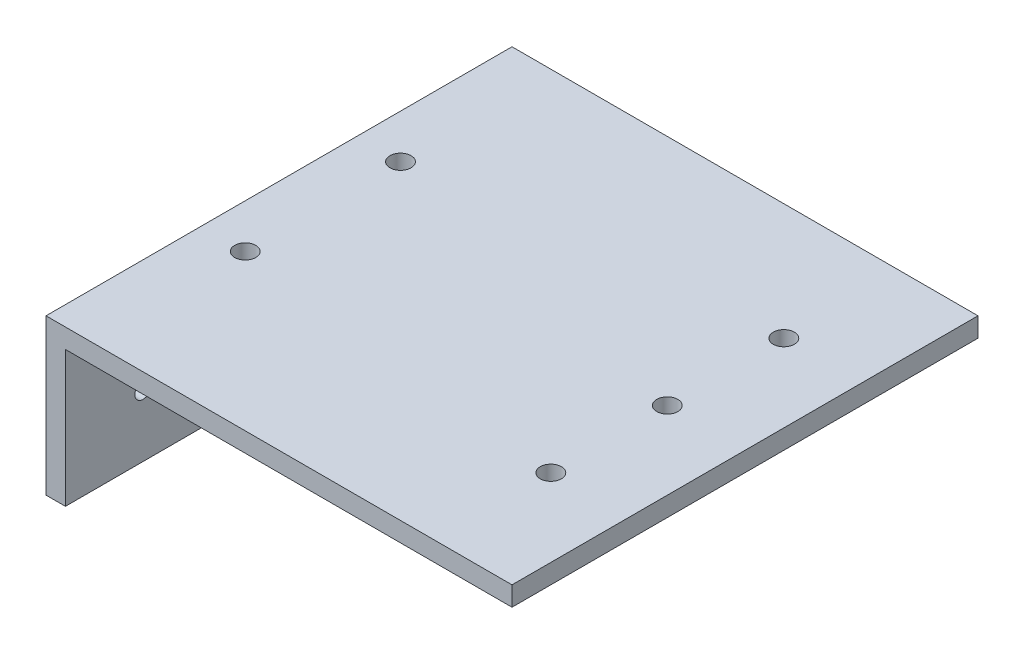
ISO-10303-21;
HEADER;
FILE_DESCRIPTION(('STEP AP214'),'2;1');
FILE_NAME('part.step','',(''),(''),'','','');
FILE_SCHEMA(('AUTOMOTIVE_DESIGN { 1 0 10303 214 1 1 1 1 }'));
ENDSEC;
DATA;
#1=APPLICATION_CONTEXT('core data for automotive mechanical design processes');
#2=APPLICATION_PROTOCOL_DEFINITION('international standard','automotive_design',2000,#1);
#3=PRODUCT_CONTEXT('',#1,'mechanical');
#4=PRODUCT('Part','Part','',(#3));
#5=PRODUCT_RELATED_PRODUCT_CATEGORY('part','',(#4));
#6=PRODUCT_DEFINITION_FORMATION('','',#4);
#7=PRODUCT_DEFINITION_CONTEXT('part definition',#1,'design');
#8=PRODUCT_DEFINITION('design','',#6,#7);
#9=PRODUCT_DEFINITION_SHAPE('','',#8);
#10=(LENGTH_UNIT() NAMED_UNIT(*) SI_UNIT(.MILLI.,.METRE.));
#11=(NAMED_UNIT(*) PLANE_ANGLE_UNIT() SI_UNIT($,.RADIAN.));
#12=(NAMED_UNIT(*) SI_UNIT($,.STERADIAN.) SOLID_ANGLE_UNIT());
#13=UNCERTAINTY_MEASURE_WITH_UNIT(LENGTH_MEASURE(1.E-05),#10,'distance_accuracy_value','');
#14=(GEOMETRIC_REPRESENTATION_CONTEXT(3) GLOBAL_UNCERTAINTY_ASSIGNED_CONTEXT((#13)) GLOBAL_UNIT_ASSIGNED_CONTEXT((#10,
#11,#12)) REPRESENTATION_CONTEXT('',''));
#15=CARTESIAN_POINT('',(0.,0.,0.));
#16=DIRECTION('',(0.,0.,1.));
#17=DIRECTION('',(1.,0.,0.));
#18=AXIS2_PLACEMENT_3D('',#15,#16,#17);
#19=CARTESIAN_POINT('',(0.,-3.17500000000001,76.2));
#20=DIRECTION('',(-1.,0.,0.));
#21=DIRECTION('',(0.,0.,1.));
#22=AXIS2_PLACEMENT_3D('',#19,#20,#21);
#23=PLANE('',#22);
#24=DIRECTION('',(0.,1.,0.));
#25=VECTOR('',#24,1.);
#26=CARTESIAN_POINT('',(0.,-3.17500000000001,0.));
#27=LINE('',#26,#25);
#28=CARTESIAN_POINT('',(0.,-3.17500000000001,0.));
#29=VERTEX_POINT('',#28);
#30=CARTESIAN_POINT('',(0.,0.,0.));
#31=VERTEX_POINT('',#30);
#32=EDGE_CURVE('E119',#29,#31,#27,.T.);
#33=ORIENTED_EDGE('',*,*,#32,.T.);
#34=DIRECTION('',(0.,0.,-1.));
#35=VECTOR('',#34,1.);
#36=CARTESIAN_POINT('',(0.,0.,76.2));
#37=LINE('',#36,#35);
#38=CARTESIAN_POINT('',(0.,0.,76.2));
#39=VERTEX_POINT('',#38);
#40=EDGE_CURVE('E11',#39,#31,#37,.T.);
#41=ORIENTED_EDGE('',*,*,#40,.F.);
#42=DIRECTION('',(0.,1.,0.));
#43=VECTOR('',#42,1.);
#44=CARTESIAN_POINT('',(0.,-3.17500000000001,76.2));
#45=LINE('',#44,#43);
#46=CARTESIAN_POINT('',(0.,-3.17500000000001,76.2));
#47=VERTEX_POINT('',#46);
#48=EDGE_CURVE('E130',#47,#39,#45,.T.);
#49=ORIENTED_EDGE('',*,*,#48,.F.);
#50=DIRECTION('',(0.,0.,-1.));
#51=VECTOR('',#50,1.);
#52=CARTESIAN_POINT('',(0.,-3.17500000000001,76.2));
#53=LINE('',#52,#51);
#54=EDGE_CURVE('E115',#47,#29,#53,.T.);
#55=ORIENTED_EDGE('',*,*,#54,.T.);
#56=EDGE_LOOP('',(#33,#41,#49,#55));
#57=FACE_BOUND('',#56,.T.);
#58=ADVANCED_FACE('F35',(#57),#23,.F.);
#59=CARTESIAN_POINT('',(0.,0.,76.2));
#60=DIRECTION('',(0.,-1.,0.));
#61=DIRECTION('',(1.,0.,0.));
#62=AXIS2_PLACEMENT_3D('',#59,#60,#61);
#63=PLANE('',#62);
#64=CARTESIAN_POINT('',(-69.0285145614773,0.,25.4));
#65=DIRECTION('',(0.,1.,0.));
#66=DIRECTION('',(0.,0.,1.));
#67=AXIS2_PLACEMENT_3D('',#64,#65,#66);
#68=CIRCLE('',#67,1.72719999999998);
#69=CARTESIAN_POINT('',(-69.0285145614773,0.,27.1272));
#70=VERTEX_POINT('',#69);
#71=EDGE_CURVE('E335',#70,#70,#68,.T.);
#72=ORIENTED_EDGE('',*,*,#71,.F.);
#73=EDGE_LOOP('',(#72));
#74=FACE_BOUND('',#73,.T.);
#75=CARTESIAN_POINT('',(-69.0285145614773,0.,50.8));
#76=DIRECTION('',(0.,1.,0.));
#77=DIRECTION('',(0.,0.,1.));
#78=AXIS2_PLACEMENT_3D('',#75,#76,#77);
#79=CIRCLE('',#78,1.72719999999998);
#80=CARTESIAN_POINT('',(-69.0285145614773,0.,52.5272));
#81=VERTEX_POINT('',#80);
#82=EDGE_CURVE('E330',#81,#81,#79,.T.);
#83=ORIENTED_EDGE('',*,*,#82,.F.);
#84=EDGE_LOOP('',(#83));
#85=FACE_BOUND('',#84,.T.);
#86=CARTESIAN_POINT('',(-12.7,0.,19.05));
#87=DIRECTION('',(0.,1.,0.));
#88=DIRECTION('',(0.,0.,1.));
#89=AXIS2_PLACEMENT_3D('',#86,#87,#88);
#90=CIRCLE('',#89,1.72719999999999);
#91=CARTESIAN_POINT('',(-12.7,0.,20.7772));
#92=VERTEX_POINT('',#91);
#93=EDGE_CURVE('E324',#92,#92,#90,.T.);
#94=ORIENTED_EDGE('',*,*,#93,.F.);
#95=EDGE_LOOP('',(#94));
#96=FACE_BOUND('',#95,.T.);
#97=CARTESIAN_POINT('',(-12.7,0.,38.1));
#98=DIRECTION('',(0.,1.,0.));
#99=DIRECTION('',(0.,0.,1.));
#100=AXIS2_PLACEMENT_3D('',#97,#98,#99);
#101=CIRCLE('',#100,1.72719999999999);
#102=CARTESIAN_POINT('',(-12.7,0.,39.8272));
#103=VERTEX_POINT('',#102);
#104=EDGE_CURVE('E318',#103,#103,#101,.T.);
#105=ORIENTED_EDGE('',*,*,#104,.F.);
#106=EDGE_LOOP('',(#105));
#107=FACE_BOUND('',#106,.T.);
#108=CARTESIAN_POINT('',(-12.7,0.,57.15));
#109=DIRECTION('',(0.,1.,0.));
#110=DIRECTION('',(0.,0.,1.));
#111=AXIS2_PLACEMENT_3D('',#108,#109,#110);
#112=CIRCLE('',#111,1.72719999999999);
#113=CARTESIAN_POINT('',(-12.7,0.,58.8772));
#114=VERTEX_POINT('',#113);
#115=EDGE_CURVE('E312',#114,#114,#112,.T.);
#116=ORIENTED_EDGE('',*,*,#115,.F.);
#117=EDGE_LOOP('',(#116));
#118=FACE_BOUND('',#117,.T.);
#119=DIRECTION('',(-1.,0.,0.));
#120=VECTOR('',#119,1.);
#121=CARTESIAN_POINT('',(0.,0.,0.));
#122=LINE('',#121,#120);
#123=CARTESIAN_POINT('',(-76.2,0.,0.));
#124=VERTEX_POINT('',#123);
#125=EDGE_CURVE('E122',#31,#124,#122,.T.);
#126=ORIENTED_EDGE('',*,*,#125,.T.);
#127=DIRECTION('',(0.,0.,-1.));
#128=VECTOR('',#127,1.);
#129=CARTESIAN_POINT('',(-76.2,0.,76.2));
#130=LINE('',#129,#128);
#131=CARTESIAN_POINT('',(-76.2,0.,76.2));
#132=VERTEX_POINT('',#131);
#133=EDGE_CURVE('E43',#132,#124,#130,.T.);
#134=ORIENTED_EDGE('',*,*,#133,.F.);
#135=DIRECTION('',(-1.,0.,0.));
#136=VECTOR('',#135,1.);
#137=CARTESIAN_POINT('',(0.,0.,76.2));
#138=LINE('',#137,#136);
#139=EDGE_CURVE('E88',#39,#132,#138,.T.);
#140=ORIENTED_EDGE('',*,*,#139,.F.);
#141=ORIENTED_EDGE('',*,*,#40,.T.);
#142=EDGE_LOOP('',(#126,#134,#140,#141));
#143=FACE_BOUND('',#142,.T.);
#144=ADVANCED_FACE('F158',(#74,#85,#96,#107,#118,#143),#63,.F.);
#145=CARTESIAN_POINT('',(-76.2,0.,76.2));
#146=DIRECTION('',(1.,0.,0.));
#147=DIRECTION('',(0.,0.,-1.));
#148=AXIS2_PLACEMENT_3D('',#145,#146,#147);
#149=PLANE('',#148);
#150=CARTESIAN_POINT('',(-76.2,-15.24,50.8));
#151=DIRECTION('',(-1.,0.,0.));
#152=DIRECTION('',(0.,0.,1.));
#153=AXIS2_PLACEMENT_3D('',#150,#151,#152);
#154=CIRCLE('',#153,1.35255);
#155=CARTESIAN_POINT('',(-76.2,-15.24,52.15255));
#156=VERTEX_POINT('',#155);
#157=EDGE_CURVE('E347',#156,#156,#154,.T.);
#158=ORIENTED_EDGE('',*,*,#157,.F.);
#159=EDGE_LOOP('',(#158));
#160=FACE_BOUND('',#159,.T.);
#161=CARTESIAN_POINT('',(-76.2,-15.24,63.5));
#162=DIRECTION('',(-1.,0.,0.));
#163=DIRECTION('',(0.,0.,1.));
#164=AXIS2_PLACEMENT_3D('',#161,#162,#163);
#165=CIRCLE('',#164,1.35255);
#166=CARTESIAN_POINT('',(-76.2,-15.24,64.85255));
#167=VERTEX_POINT('',#166);
#168=EDGE_CURVE('E341',#167,#167,#165,.T.);
#169=ORIENTED_EDGE('',*,*,#168,.F.);
#170=EDGE_LOOP('',(#169));
#171=FACE_BOUND('',#170,.T.);
#172=CARTESIAN_POINT('',(-76.2,-15.24,38.1));
#173=DIRECTION('',(-1.,0.,0.));
#174=DIRECTION('',(0.,0.,1.));
#175=AXIS2_PLACEMENT_3D('',#172,#173,#174);
#176=CIRCLE('',#175,3.175);
#177=CARTESIAN_POINT('',(-76.2,-15.24,41.275));
#178=VERTEX_POINT('',#177);
#179=EDGE_CURVE('E300',#178,#178,#176,.T.);
#180=ORIENTED_EDGE('',*,*,#179,.F.);
#181=EDGE_LOOP('',(#180));
#182=FACE_BOUND('',#181,.T.);
#183=DIRECTION('',(0.,-1.,0.));
#184=VECTOR('',#183,1.);
#185=CARTESIAN_POINT('',(-76.2,0.,0.));
#186=LINE('',#185,#184);
#187=CARTESIAN_POINT('',(-76.2,-25.4,0.));
#188=VERTEX_POINT('',#187);
#189=EDGE_CURVE('E125',#124,#188,#186,.T.);
#190=ORIENTED_EDGE('',*,*,#189,.T.);
#191=DIRECTION('',(0.,0.,-1.));
#192=VECTOR('',#191,1.);
#193=CARTESIAN_POINT('',(-76.2,-25.4,76.2));
#194=LINE('',#193,#192);
#195=CARTESIAN_POINT('',(-76.2,-25.4,76.2));
#196=VERTEX_POINT('',#195);
#197=EDGE_CURVE('E110',#196,#188,#194,.T.);
#198=ORIENTED_EDGE('',*,*,#197,.F.);
#199=DIRECTION('',(0.,-1.,0.));
#200=VECTOR('',#199,1.);
#201=CARTESIAN_POINT('',(-76.2,0.,76.2));
#202=LINE('',#201,#200);
#203=EDGE_CURVE('E101',#132,#196,#202,.T.);
#204=ORIENTED_EDGE('',*,*,#203,.F.);
#205=ORIENTED_EDGE('',*,*,#133,.T.);
#206=EDGE_LOOP('',(#190,#198,#204,#205));
#207=FACE_BOUND('',#206,.T.);
#208=ADVANCED_FACE('F136',(#160,#171,#182,#207),#149,.F.);
#209=CARTESIAN_POINT('',(-76.2,-25.4,76.2));
#210=DIRECTION('',(0.,1.,0.));
#211=DIRECTION('',(0.,0.,1.));
#212=AXIS2_PLACEMENT_3D('',#209,#210,#211);
#213=PLANE('',#212);
#214=DIRECTION('',(1.,0.,0.));
#215=VECTOR('',#214,1.);
#216=CARTESIAN_POINT('',(-76.2,-25.4,0.));
#217=LINE('',#216,#215);
#218=CARTESIAN_POINT('',(-73.025,-25.4,0.));
#219=VERTEX_POINT('',#218);
#220=EDGE_CURVE('E109',#188,#219,#217,.T.);
#221=ORIENTED_EDGE('',*,*,#220,.T.);
#222=DIRECTION('',(0.,0.,-1.));
#223=VECTOR('',#222,1.);
#224=CARTESIAN_POINT('',(-73.025,-25.4,76.2));
#225=LINE('',#224,#223);
#226=CARTESIAN_POINT('',(-73.025,-25.4,76.2));
#227=VERTEX_POINT('',#226);
#228=EDGE_CURVE('E106',#227,#219,#225,.T.);
#229=ORIENTED_EDGE('',*,*,#228,.F.);
#230=DIRECTION('',(1.,0.,0.));
#231=VECTOR('',#230,1.);
#232=CARTESIAN_POINT('',(-76.2,-25.4,76.2));
#233=LINE('',#232,#231);
#234=EDGE_CURVE('E95',#196,#227,#233,.T.);
#235=ORIENTED_EDGE('',*,*,#234,.F.);
#236=ORIENTED_EDGE('',*,*,#197,.T.);
#237=EDGE_LOOP('',(#221,#229,#235,#236));
#238=FACE_BOUND('',#237,.T.);
#239=ADVANCED_FACE('F107',(#238),#213,.F.);
#240=CARTESIAN_POINT('',(-73.025,-25.4,76.2));
#241=DIRECTION('',(-1.,0.,0.));
#242=DIRECTION('',(0.,0.,1.));
#243=AXIS2_PLACEMENT_3D('',#240,#241,#242);
#244=PLANE('',#243);
#245=CARTESIAN_POINT('',(-73.025,-15.24,50.8));
#246=DIRECTION('',(-1.,0.,0.));
#247=DIRECTION('',(0.,0.,1.));
#248=AXIS2_PLACEMENT_3D('',#245,#246,#247);
#249=CIRCLE('',#248,1.35255);
#250=CARTESIAN_POINT('',(-73.025,-15.24,52.15255));
#251=VERTEX_POINT('',#250);
#252=EDGE_CURVE('E344',#251,#251,#249,.T.);
#253=ORIENTED_EDGE('',*,*,#252,.T.);
#254=EDGE_LOOP('',(#253));
#255=FACE_BOUND('',#254,.T.);
#256=CARTESIAN_POINT('',(-73.025,-15.24,63.5));
#257=DIRECTION('',(-1.,0.,0.));
#258=DIRECTION('',(0.,0.,1.));
#259=AXIS2_PLACEMENT_3D('',#256,#257,#258);
#260=CIRCLE('',#259,1.35255);
#261=CARTESIAN_POINT('',(-73.025,-15.24,64.85255));
#262=VERTEX_POINT('',#261);
#263=EDGE_CURVE('E338',#262,#262,#260,.T.);
#264=ORIENTED_EDGE('',*,*,#263,.T.);
#265=EDGE_LOOP('',(#264));
#266=FACE_BOUND('',#265,.T.);
#267=CARTESIAN_POINT('',(-73.025,-15.24,38.1));
#268=DIRECTION('',(-1.,0.,0.));
#269=DIRECTION('',(0.,0.,1.));
#270=AXIS2_PLACEMENT_3D('',#267,#268,#269);
#271=CIRCLE('',#270,3.175);
#272=CARTESIAN_POINT('',(-73.025,-15.24,41.275));
#273=VERTEX_POINT('',#272);
#274=EDGE_CURVE('E123',#273,#273,#271,.F.);
#275=ORIENTED_EDGE('',*,*,#274,.F.);
#276=EDGE_LOOP('',(#275));
#277=FACE_BOUND('',#276,.T.);
#278=DIRECTION('',(0.,1.,0.));
#279=VECTOR('',#278,1.);
#280=CARTESIAN_POINT('',(-73.025,-25.4,0.));
#281=LINE('',#280,#279);
#282=CARTESIAN_POINT('',(-73.025,-3.17500000000001,0.));
#283=VERTEX_POINT('',#282);
#284=EDGE_CURVE('E74',#219,#283,#281,.T.);
#285=ORIENTED_EDGE('',*,*,#284,.T.);
#286=DIRECTION('',(0.,0.,-1.));
#287=VECTOR('',#286,1.);
#288=CARTESIAN_POINT('',(-73.025,-3.17500000000001,76.2));
#289=LINE('',#288,#287);
#290=CARTESIAN_POINT('',(-73.025,-3.17500000000001,76.2));
#291=VERTEX_POINT('',#290);
#292=EDGE_CURVE('E111',#291,#283,#289,.T.);
#293=ORIENTED_EDGE('',*,*,#292,.F.);
#294=DIRECTION('',(0.,1.,0.));
#295=VECTOR('',#294,1.);
#296=CARTESIAN_POINT('',(-73.025,-25.4,76.2));
#297=LINE('',#296,#295);
#298=EDGE_CURVE('E99',#227,#291,#297,.T.);
#299=ORIENTED_EDGE('',*,*,#298,.F.);
#300=ORIENTED_EDGE('',*,*,#228,.T.);
#301=EDGE_LOOP('',(#285,#293,#299,#300));
#302=FACE_BOUND('',#301,.T.);
#303=ADVANCED_FACE('F113',(#255,#266,#277,#302),#244,.F.);
#304=CARTESIAN_POINT('',(-73.025,-3.17500000000001,76.2));
#305=DIRECTION('',(0.,1.,0.));
#306=DIRECTION('',(-1.,0.,0.));
#307=AXIS2_PLACEMENT_3D('',#304,#305,#306);
#308=PLANE('',#307);
#309=CARTESIAN_POINT('',(-69.0285145614773,-3.17500000000001,25.4));
#310=DIRECTION('',(0.,1.,0.));
#311=DIRECTION('',(-1.,0.,0.));
#312=AXIS2_PLACEMENT_3D('',#309,#310,#311);
#313=CIRCLE('',#312,1.72719999999999);
#314=CARTESIAN_POINT('',(-70.7557145614772,-3.17500000000001,25.4));
#315=VERTEX_POINT('',#314);
#316=EDGE_CURVE('E333',#315,#315,#313,.T.);
#317=ORIENTED_EDGE('',*,*,#316,.T.);
#318=EDGE_LOOP('',(#317));
#319=FACE_BOUND('',#318,.T.);
#320=CARTESIAN_POINT('',(-69.0285145614773,-3.17500000000001,50.8));
#321=DIRECTION('',(0.,1.,0.));
#322=DIRECTION('',(-1.,0.,0.));
#323=AXIS2_PLACEMENT_3D('',#320,#321,#322);
#324=CIRCLE('',#323,1.72719999999999);
#325=CARTESIAN_POINT('',(-70.7557145614772,-3.17500000000001,50.8));
#326=VERTEX_POINT('',#325);
#327=EDGE_CURVE('E327',#326,#326,#324,.T.);
#328=ORIENTED_EDGE('',*,*,#327,.T.);
#329=EDGE_LOOP('',(#328));
#330=FACE_BOUND('',#329,.T.);
#331=CARTESIAN_POINT('',(-12.7,-3.17500000000001,19.05));
#332=DIRECTION('',(0.,1.,0.));
#333=DIRECTION('',(-1.,0.,0.));
#334=AXIS2_PLACEMENT_3D('',#331,#332,#333);
#335=CIRCLE('',#334,1.72719999999999);
#336=CARTESIAN_POINT('',(-14.4272,-3.17500000000001,19.05));
#337=VERTEX_POINT('',#336);
#338=EDGE_CURVE('E321',#337,#337,#335,.T.);
#339=ORIENTED_EDGE('',*,*,#338,.T.);
#340=EDGE_LOOP('',(#339));
#341=FACE_BOUND('',#340,.T.);
#342=CARTESIAN_POINT('',(-12.7,-3.17500000000001,38.1));
#343=DIRECTION('',(0.,1.,0.));
#344=DIRECTION('',(-1.,0.,0.));
#345=AXIS2_PLACEMENT_3D('',#342,#343,#344);
#346=CIRCLE('',#345,1.72719999999999);
#347=CARTESIAN_POINT('',(-14.4272,-3.17500000000001,38.1));
#348=VERTEX_POINT('',#347);
#349=EDGE_CURVE('E315',#348,#348,#346,.T.);
#350=ORIENTED_EDGE('',*,*,#349,.T.);
#351=EDGE_LOOP('',(#350));
#352=FACE_BOUND('',#351,.T.);
#353=CARTESIAN_POINT('',(-12.7,-3.17500000000001,57.15));
#354=DIRECTION('',(0.,1.,0.));
#355=DIRECTION('',(-1.,0.,0.));
#356=AXIS2_PLACEMENT_3D('',#353,#354,#355);
#357=CIRCLE('',#356,1.72719999999999);
#358=CARTESIAN_POINT('',(-14.4272,-3.17500000000001,57.15));
#359=VERTEX_POINT('',#358);
#360=EDGE_CURVE('E305',#359,#359,#357,.T.);
#361=ORIENTED_EDGE('',*,*,#360,.T.);
#362=EDGE_LOOP('',(#361));
#363=FACE_BOUND('',#362,.T.);
#364=DIRECTION('',(1.,0.,0.));
#365=VECTOR('',#364,1.);
#366=CARTESIAN_POINT('',(-73.025,-3.17500000000001,0.));
#367=LINE('',#366,#365);
#368=EDGE_CURVE('E80',#283,#29,#367,.T.);
#369=ORIENTED_EDGE('',*,*,#368,.T.);
#370=ORIENTED_EDGE('',*,*,#54,.F.);
#371=DIRECTION('',(1.,0.,0.));
#372=VECTOR('',#371,1.);
#373=CARTESIAN_POINT('',(-73.025,-3.17500000000001,76.2));
#374=LINE('',#373,#372);
#375=EDGE_CURVE('E51',#291,#47,#374,.T.);
#376=ORIENTED_EDGE('',*,*,#375,.F.);
#377=ORIENTED_EDGE('',*,*,#292,.T.);
#378=EDGE_LOOP('',(#369,#370,#376,#377));
#379=FACE_BOUND('',#378,.T.);
#380=ADVANCED_FACE('F143',(#319,#330,#341,#352,#363,#379),#308,.F.);
#381=CARTESIAN_POINT('',(0.,0.,76.2));
#382=DIRECTION('',(0.,0.,1.));
#383=DIRECTION('',(1.,0.,0.));
#384=AXIS2_PLACEMENT_3D('',#381,#382,#383);
#385=PLANE('',#384);
#386=ORIENTED_EDGE('',*,*,#48,.T.);
#387=ORIENTED_EDGE('',*,*,#139,.T.);
#388=ORIENTED_EDGE('',*,*,#203,.T.);
#389=ORIENTED_EDGE('',*,*,#234,.T.);
#390=ORIENTED_EDGE('',*,*,#298,.T.);
#391=ORIENTED_EDGE('',*,*,#375,.T.);
#392=EDGE_LOOP('',(#386,#387,#388,#389,#390,#391));
#393=FACE_BOUND('',#392,.T.);
#394=ADVANCED_FACE('F97',(#393),#385,.T.);
#395=CARTESIAN_POINT('',(0.,0.,0.));
#396=DIRECTION('',(0.,0.,1.));
#397=DIRECTION('',(1.,0.,0.));
#398=AXIS2_PLACEMENT_3D('',#395,#396,#397);
#399=PLANE('',#398);
#400=ORIENTED_EDGE('',*,*,#32,.F.);
#401=ORIENTED_EDGE('',*,*,#368,.F.);
#402=ORIENTED_EDGE('',*,*,#284,.F.);
#403=ORIENTED_EDGE('',*,*,#220,.F.);
#404=ORIENTED_EDGE('',*,*,#189,.F.);
#405=ORIENTED_EDGE('',*,*,#125,.F.);
#406=EDGE_LOOP('',(#400,#401,#402,#403,#404,#405));
#407=FACE_BOUND('',#406,.T.);
#408=ADVANCED_FACE('F139',(#407),#399,.F.);
#409=CARTESIAN_POINT('',(0.001000000000001,-15.24,38.1));
#410=DIRECTION('',(-1.,0.,0.));
#411=DIRECTION('',(0.,0.,1.));
#412=AXIS2_PLACEMENT_3D('',#409,#410,#411);
#413=CYLINDRICAL_SURFACE('',#412,3.175);
#414=ORIENTED_EDGE('',*,*,#179,.T.);
#415=EDGE_LOOP('',(#414));
#416=FACE_BOUND('',#415,.T.);
#417=ORIENTED_EDGE('',*,*,#274,.T.);
#418=EDGE_LOOP('',(#417));
#419=FACE_BOUND('',#418,.T.);
#420=ADVANCED_FACE('F232',(#416,#419),#413,.F.);
#421=CARTESIAN_POINT('',(-12.7,0.,57.15));
#422=DIRECTION('',(0.,1.,0.));
#423=DIRECTION('',(0.,0.,1.));
#424=AXIS2_PLACEMENT_3D('',#421,#422,#423);
#425=CYLINDRICAL_SURFACE('',#424,1.72719999999999);
#426=ORIENTED_EDGE('',*,*,#115,.T.);
#427=EDGE_LOOP('',(#426));
#428=FACE_BOUND('',#427,.T.);
#429=ORIENTED_EDGE('',*,*,#360,.F.);
#430=EDGE_LOOP('',(#429));
#431=FACE_BOUND('',#430,.T.);
#432=ADVANCED_FACE('F228',(#428,#431),#425,.F.);
#433=CARTESIAN_POINT('',(-12.7,0.,38.1));
#434=DIRECTION('',(0.,1.,0.));
#435=DIRECTION('',(0.,0.,1.));
#436=AXIS2_PLACEMENT_3D('',#433,#434,#435);
#437=CYLINDRICAL_SURFACE('',#436,1.72719999999999);
#438=ORIENTED_EDGE('',*,*,#104,.T.);
#439=EDGE_LOOP('',(#438));
#440=FACE_BOUND('',#439,.T.);
#441=ORIENTED_EDGE('',*,*,#349,.F.);
#442=EDGE_LOOP('',(#441));
#443=FACE_BOUND('',#442,.T.);
#444=ADVANCED_FACE('F224',(#440,#443),#437,.F.);
#445=CARTESIAN_POINT('',(-12.7,0.,19.05));
#446=DIRECTION('',(0.,1.,0.));
#447=DIRECTION('',(0.,0.,1.));
#448=AXIS2_PLACEMENT_3D('',#445,#446,#447);
#449=CYLINDRICAL_SURFACE('',#448,1.72719999999999);
#450=ORIENTED_EDGE('',*,*,#93,.T.);
#451=EDGE_LOOP('',(#450));
#452=FACE_BOUND('',#451,.T.);
#453=ORIENTED_EDGE('',*,*,#338,.F.);
#454=EDGE_LOOP('',(#453));
#455=FACE_BOUND('',#454,.T.);
#456=ADVANCED_FACE('F220',(#452,#455),#449,.F.);
#457=CARTESIAN_POINT('',(-69.0285145614773,0.,50.8));
#458=DIRECTION('',(0.,1.,0.));
#459=DIRECTION('',(0.,0.,1.));
#460=AXIS2_PLACEMENT_3D('',#457,#458,#459);
#461=CYLINDRICAL_SURFACE('',#460,1.72719999999999);
#462=ORIENTED_EDGE('',*,*,#327,.F.);
#463=EDGE_LOOP('',(#462));
#464=FACE_BOUND('',#463,.T.);
#465=ORIENTED_EDGE('',*,*,#82,.T.);
#466=EDGE_LOOP('',(#465));
#467=FACE_BOUND('',#466,.T.);
#468=ADVANCED_FACE('F216',(#464,#467),#461,.F.);
#469=CARTESIAN_POINT('',(-69.0285145614773,0.,25.4));
#470=DIRECTION('',(0.,1.,0.));
#471=DIRECTION('',(0.,0.,1.));
#472=AXIS2_PLACEMENT_3D('',#469,#470,#471);
#473=CYLINDRICAL_SURFACE('',#472,1.72719999999999);
#474=ORIENTED_EDGE('',*,*,#316,.F.);
#475=EDGE_LOOP('',(#474));
#476=FACE_BOUND('',#475,.T.);
#477=ORIENTED_EDGE('',*,*,#71,.T.);
#478=EDGE_LOOP('',(#477));
#479=FACE_BOUND('',#478,.T.);
#480=ADVANCED_FACE('F196',(#476,#479),#473,.F.);
#481=CARTESIAN_POINT('',(-76.2,-15.24,63.5));
#482=DIRECTION('',(-1.,0.,0.));
#483=DIRECTION('',(0.,0.,1.));
#484=AXIS2_PLACEMENT_3D('',#481,#482,#483);
#485=CYLINDRICAL_SURFACE('',#484,1.35255);
#486=ORIENTED_EDGE('',*,*,#263,.F.);
#487=EDGE_LOOP('',(#486));
#488=FACE_BOUND('',#487,.T.);
#489=ORIENTED_EDGE('',*,*,#168,.T.);
#490=EDGE_LOOP('',(#489));
#491=FACE_BOUND('',#490,.T.);
#492=ADVANCED_FACE('F190',(#488,#491),#485,.F.);
#493=CARTESIAN_POINT('',(-76.2,-15.24,50.8));
#494=DIRECTION('',(-1.,0.,0.));
#495=DIRECTION('',(0.,0.,1.));
#496=AXIS2_PLACEMENT_3D('',#493,#494,#495);
#497=CYLINDRICAL_SURFACE('',#496,1.35255);
#498=ORIENTED_EDGE('',*,*,#252,.F.);
#499=EDGE_LOOP('',(#498));
#500=FACE_BOUND('',#499,.T.);
#501=ORIENTED_EDGE('',*,*,#157,.T.);
#502=EDGE_LOOP('',(#501));
#503=FACE_BOUND('',#502,.T.);
#504=ADVANCED_FACE('F195',(#500,#503),#497,.F.);
#505=CLOSED_SHELL('',(#58,#144,#208,#239,#303,#380,#394,#408,#420,#432,#444,#456,#468,#480,#492,#504));
#506=MANIFOLD_SOLID_BREP('B2',#505);
#507=ADVANCED_BREP_SHAPE_REPRESENTATION('',(#18,#506),#14);
#508=SHAPE_DEFINITION_REPRESENTATION(#9,#507);
ENDSEC;
END-ISO-10303-21;
